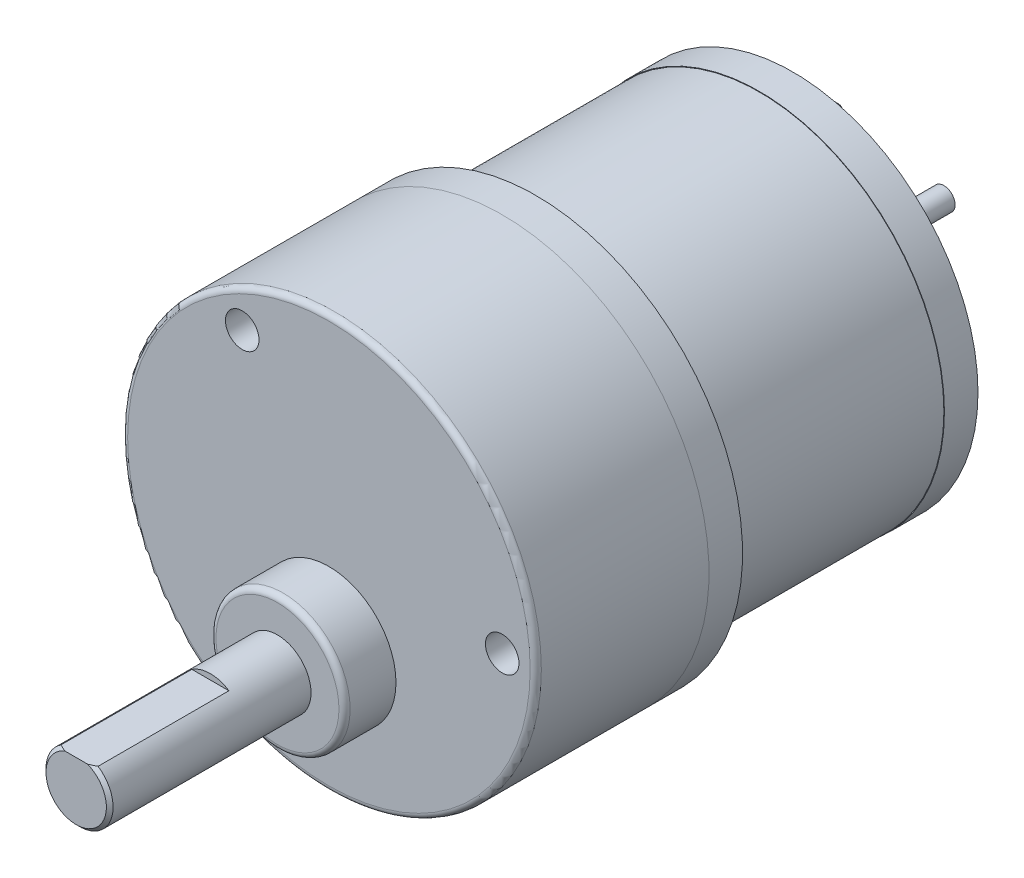
ISO-10303-21;
HEADER;
FILE_DESCRIPTION(('STEP AP214'),'2;1');
FILE_NAME('part.step','',(''),(''),'','','');
FILE_SCHEMA(('AUTOMOTIVE_DESIGN { 1 0 10303 214 1 1 1 1 }'));
ENDSEC;
DATA;
#1=APPLICATION_CONTEXT('core data for automotive mechanical design processes');
#2=APPLICATION_PROTOCOL_DEFINITION('international standard','automotive_design',2000,#1);
#3=PRODUCT_CONTEXT('',#1,'mechanical');
#4=PRODUCT('Part','Part','',(#3));
#5=PRODUCT_RELATED_PRODUCT_CATEGORY('part','',(#4));
#6=PRODUCT_DEFINITION_FORMATION('','',#4);
#7=PRODUCT_DEFINITION_CONTEXT('part definition',#1,'design');
#8=PRODUCT_DEFINITION('design','',#6,#7);
#9=PRODUCT_DEFINITION_SHAPE('','',#8);
#10=(LENGTH_UNIT() NAMED_UNIT(*) SI_UNIT(.MILLI.,.METRE.));
#11=(NAMED_UNIT(*) PLANE_ANGLE_UNIT() SI_UNIT($,.RADIAN.));
#12=(NAMED_UNIT(*) SI_UNIT($,.STERADIAN.) SOLID_ANGLE_UNIT());
#13=UNCERTAINTY_MEASURE_WITH_UNIT(LENGTH_MEASURE(1.E-05),#10,'distance_accuracy_value','');
#14=(GEOMETRIC_REPRESENTATION_CONTEXT(3) GLOBAL_UNCERTAINTY_ASSIGNED_CONTEXT((#13)) GLOBAL_UNIT_ASSIGNED_CONTEXT((#10,
#11,#12)) REPRESENTATION_CONTEXT('',''));
#15=CARTESIAN_POINT('',(0.,0.,0.));
#16=DIRECTION('',(0.,0.,1.));
#17=DIRECTION('',(1.,0.,0.));
#18=AXIS2_PLACEMENT_3D('',#15,#16,#17);
#19=CARTESIAN_POINT('',(0.,0.,-26.));
#20=DIRECTION('',(0.,0.,-1.));
#21=DIRECTION('',(-1.,0.,0.));
#22=AXIS2_PLACEMENT_3D('',#19,#20,#21);
#23=PLANE('',#22);
#24=DIRECTION('',(-1.,0.,0.));
#25=VECTOR('',#24,1.);
#26=CARTESIAN_POINT('',(0.5,10.,-26.));
#27=LINE('',#26,#25);
#28=CARTESIAN_POINT('',(0.5,10.,-26.));
#29=VERTEX_POINT('',#28);
#30=CARTESIAN_POINT('',(-0.5,10.,-26.));
#31=VERTEX_POINT('',#30);
#32=EDGE_CURVE('E194',#29,#31,#27,.T.);
#33=ORIENTED_EDGE('',*,*,#32,.F.);
#34=DIRECTION('',(0.,-1.,0.));
#35=VECTOR('',#34,1.);
#36=CARTESIAN_POINT('',(0.5,13.,-26.));
#37=LINE('',#36,#35);
#38=CARTESIAN_POINT('',(0.5,13.,-26.));
#39=VERTEX_POINT('',#38);
#40=EDGE_CURVE('E191',#39,#29,#37,.T.);
#41=ORIENTED_EDGE('',*,*,#40,.F.);
#42=DIRECTION('',(1.,0.,0.));
#43=VECTOR('',#42,1.);
#44=CARTESIAN_POINT('',(0.5,13.,-26.));
#45=LINE('',#44,#43);
#46=CARTESIAN_POINT('',(-0.5,13.,-26.));
#47=VERTEX_POINT('',#46);
#48=EDGE_CURVE('E200',#47,#39,#45,.T.);
#49=ORIENTED_EDGE('',*,*,#48,.F.);
#50=DIRECTION('',(0.,1.,0.));
#51=VECTOR('',#50,1.);
#52=CARTESIAN_POINT('',(-0.5,13.,-26.));
#53=LINE('',#52,#51);
#54=EDGE_CURVE('E197',#31,#47,#53,.T.);
#55=ORIENTED_EDGE('',*,*,#54,.F.);
#56=EDGE_LOOP('',(#33,#41,#49,#55));
#57=FACE_BOUND('',#56,.T.);
#58=CARTESIAN_POINT('',(0.,0.,-26.));
#59=DIRECTION('',(0.,0.,-1.));
#60=DIRECTION('',(-1.,0.,0.));
#61=AXIS2_PLACEMENT_3D('',#58,#59,#60);
#62=CIRCLE('',#61,16.55);
#63=CARTESIAN_POINT('',(-16.55,0.,-26.));
#64=VERTEX_POINT('',#63);
#65=EDGE_CURVE('E224',#64,#64,#62,.T.);
#66=ORIENTED_EDGE('',*,*,#65,.T.);
#67=EDGE_LOOP('',(#66));
#68=FACE_BOUND('',#67,.T.);
#69=CARTESIAN_POINT('',(0.,0.,-26.));
#70=DIRECTION('',(0.,0.,-1.));
#71=DIRECTION('',(-1.,0.,0.));
#72=AXIS2_PLACEMENT_3D('',#69,#70,#71);
#73=CIRCLE('',#72,4.5);
#74=CARTESIAN_POINT('',(-4.5,0.,-26.));
#75=VERTEX_POINT('',#74);
#76=EDGE_CURVE('E215',#75,#75,#73,.T.);
#77=ORIENTED_EDGE('',*,*,#76,.F.);
#78=EDGE_LOOP('',(#77));
#79=FACE_BOUND('',#78,.T.);
#80=DIRECTION('',(-1.,0.,0.));
#81=VECTOR('',#80,1.);
#82=CARTESIAN_POINT('',(0.5,-13.,-26.));
#83=LINE('',#82,#81);
#84=CARTESIAN_POINT('',(0.5,-13.,-26.));
#85=VERTEX_POINT('',#84);
#86=CARTESIAN_POINT('',(-0.499999999999999,-13.,-26.));
#87=VERTEX_POINT('',#86);
#88=EDGE_CURVE('E174',#85,#87,#83,.T.);
#89=ORIENTED_EDGE('',*,*,#88,.F.);
#90=DIRECTION('',(0.,-1.,0.));
#91=VECTOR('',#90,1.);
#92=CARTESIAN_POINT('',(0.500000000000001,-10.,-26.));
#93=LINE('',#92,#91);
#94=CARTESIAN_POINT('',(0.500000000000001,-10.,-26.));
#95=VERTEX_POINT('',#94);
#96=EDGE_CURVE('E171',#95,#85,#93,.T.);
#97=ORIENTED_EDGE('',*,*,#96,.F.);
#98=DIRECTION('',(1.,0.,0.));
#99=VECTOR('',#98,1.);
#100=CARTESIAN_POINT('',(0.500000000000001,-10.,-26.));
#101=LINE('',#100,#99);
#102=CARTESIAN_POINT('',(-0.499999999999999,-10.,-26.));
#103=VERTEX_POINT('',#102);
#104=EDGE_CURVE('E180',#103,#95,#101,.T.);
#105=ORIENTED_EDGE('',*,*,#104,.F.);
#106=DIRECTION('',(0.,1.,0.));
#107=VECTOR('',#106,1.);
#108=CARTESIAN_POINT('',(-0.499999999999999,-10.,-26.));
#109=LINE('',#108,#107);
#110=EDGE_CURVE('E177',#87,#103,#109,.T.);
#111=ORIENTED_EDGE('',*,*,#110,.F.);
#112=EDGE_LOOP('',(#89,#97,#105,#111));
#113=FACE_BOUND('',#112,.T.);
#114=ADVANCED_FACE('F32',(#57,#68,#79,#113),#23,.T.);
#115=CARTESIAN_POINT('',(0.,0.,-29.));
#116=DIRECTION('',(0.,0.,-1.));
#117=DIRECTION('',(-1.,0.,0.));
#118=AXIS2_PLACEMENT_3D('',#115,#116,#117);
#119=PLANE('',#118);
#120=CARTESIAN_POINT('',(0.,0.,-29.));
#121=DIRECTION('',(0.,0.,-1.));
#122=DIRECTION('',(-1.,0.,0.));
#123=AXIS2_PLACEMENT_3D('',#120,#121,#122);
#124=CIRCLE('',#123,4.5);
#125=CARTESIAN_POINT('',(-4.5,0.,-29.));
#126=VERTEX_POINT('',#125);
#127=EDGE_CURVE('E218',#126,#126,#124,.T.);
#128=ORIENTED_EDGE('',*,*,#127,.T.);
#129=EDGE_LOOP('',(#128));
#130=FACE_BOUND('',#129,.T.);
#131=CARTESIAN_POINT('',(0.,0.,-29.));
#132=DIRECTION('',(0.,0.,-1.));
#133=DIRECTION('',(-1.,0.,0.));
#134=AXIS2_PLACEMENT_3D('',#131,#132,#133);
#135=CIRCLE('',#134,1.);
#136=CARTESIAN_POINT('',(1.,0.,-29.));
#137=VERTEX_POINT('',#136);
#138=EDGE_CURVE('E211',#137,#137,#135,.T.);
#139=ORIENTED_EDGE('',*,*,#138,.F.);
#140=EDGE_LOOP('',(#139));
#141=FACE_BOUND('',#140,.T.);
#142=ADVANCED_FACE('F438',(#130,#141),#119,.T.);
#143=CARTESIAN_POINT('',(0.,0.,-3.));
#144=DIRECTION('',(0.,0.,-1.));
#145=DIRECTION('',(-1.,0.,0.));
#146=AXIS2_PLACEMENT_3D('',#143,#144,#145);
#147=PLANE('',#146);
#148=CARTESIAN_POINT('',(0.,0.,-3.));
#149=DIRECTION('',(0.,0.,-1.));
#150=DIRECTION('',(-1.,0.,0.));
#151=AXIS2_PLACEMENT_3D('',#148,#149,#150);
#152=CIRCLE('',#151,18.495);
#153=CARTESIAN_POINT('',(-18.495,0.,-3.));
#154=VERTEX_POINT('',#153);
#155=EDGE_CURVE('E236',#154,#154,#152,.T.);
#156=ORIENTED_EDGE('',*,*,#155,.T.);
#157=EDGE_LOOP('',(#156));
#158=FACE_BOUND('',#157,.T.);
#159=CARTESIAN_POINT('',(0.,0.,-3.));
#160=DIRECTION('',(0.,0.,-1.));
#161=DIRECTION('',(-1.,0.,0.));
#162=AXIS2_PLACEMENT_3D('',#159,#160,#161);
#163=CIRCLE('',#162,16.5);
#164=CARTESIAN_POINT('',(-16.5,0.,-3.));
#165=VERTEX_POINT('',#164);
#166=EDGE_CURVE('E227',#165,#165,#163,.T.);
#167=ORIENTED_EDGE('',*,*,#166,.F.);
#168=EDGE_LOOP('',(#167));
#169=FACE_BOUND('',#168,.T.);
#170=ADVANCED_FACE('F262',(#158,#169),#147,.T.);
#171=CARTESIAN_POINT('',(0.,-7.,20.1));
#172=DIRECTION('',(0.,0.,1.));
#173=DIRECTION('',(1.,0.,0.));
#174=AXIS2_PLACEMENT_3D('',#171,#172,#173);
#175=PLANE('',#174);
#176=CARTESIAN_POINT('',(0.,-7.,20.1));
#177=DIRECTION('',(0.,0.,1.));
#178=DIRECTION('',(1.,0.,0.));
#179=AXIS2_PLACEMENT_3D('',#176,#177,#178);
#180=CIRCLE('',#179,5.5);
#181=CARTESIAN_POINT('',(5.5,-7.,20.1));
#182=VERTEX_POINT('',#181);
#183=EDGE_CURVE('E329',#182,#182,#180,.T.);
#184=ORIENTED_EDGE('',*,*,#183,.T.);
#185=EDGE_LOOP('',(#184));
#186=FACE_BOUND('',#185,.T.);
#187=CARTESIAN_POINT('',(0.,-7.,20.1));
#188=DIRECTION('',(0.,0.,1.));
#189=DIRECTION('',(1.,0.,0.));
#190=AXIS2_PLACEMENT_3D('',#187,#188,#189);
#191=CIRCLE('',#190,3.);
#192=CARTESIAN_POINT('',(3.,-7.,20.1));
#193=VERTEX_POINT('',#192);
#194=EDGE_CURVE('E239',#193,#193,#191,.T.);
#195=ORIENTED_EDGE('',*,*,#194,.F.);
#196=EDGE_LOOP('',(#195));
#197=FACE_BOUND('',#196,.T.);
#198=ADVANCED_FACE('F270',(#186,#197),#175,.T.);
#199=CARTESIAN_POINT('',(0.,0.,15.5));
#200=DIRECTION('',(0.,0.,1.));
#201=DIRECTION('',(1.,0.,0.));
#202=AXIS2_PLACEMENT_3D('',#199,#200,#201);
#203=PLANE('',#202);
#204=CARTESIAN_POINT('',(0.,0.,15.5));
#205=DIRECTION('',(0.,0.,1.));
#206=DIRECTION('',(1.,0.,0.));
#207=AXIS2_PLACEMENT_3D('',#204,#205,#206);
#208=CIRCLE('',#207,18.);
#209=CARTESIAN_POINT('',(18.,0.,15.5));
#210=VERTEX_POINT('',#209);
#211=EDGE_CURVE('E339',#210,#210,#208,.T.);
#212=ORIENTED_EDGE('',*,*,#211,.T.);
#213=EDGE_LOOP('',(#212));
#214=FACE_BOUND('',#213,.T.);
#215=CARTESIAN_POINT('',(-7.74999999999994,13.4233937586588,15.5));
#216=DIRECTION('',(0.,0.,1.));
#217=DIRECTION('',(1.,0.,0.));
#218=AXIS2_PLACEMENT_3D('',#215,#216,#217);
#219=CIRCLE('',#218,1.5);
#220=CARTESIAN_POINT('',(-6.24999999999994,13.4233937586588,15.5));
#221=VERTEX_POINT('',#220);
#222=EDGE_CURVE('E140',#221,#221,#219,.T.);
#223=ORIENTED_EDGE('',*,*,#222,.F.);
#224=EDGE_LOOP('',(#223));
#225=FACE_BOUND('',#224,.T.);
#226=CARTESIAN_POINT('',(-7.75,-13.4233937586588,15.5));
#227=DIRECTION('',(0.,0.,1.));
#228=DIRECTION('',(1.,0.,0.));
#229=AXIS2_PLACEMENT_3D('',#226,#227,#228);
#230=CIRCLE('',#229,1.5);
#231=CARTESIAN_POINT('',(-6.25,-13.4233937586588,15.5));
#232=VERTEX_POINT('',#231);
#233=EDGE_CURVE('E147',#232,#232,#230,.T.);
#234=ORIENTED_EDGE('',*,*,#233,.F.);
#235=EDGE_LOOP('',(#234));
#236=FACE_BOUND('',#235,.T.);
#237=CARTESIAN_POINT('',(15.5,0.,15.5));
#238=DIRECTION('',(0.,0.,1.));
#239=DIRECTION('',(1.,0.,0.));
#240=AXIS2_PLACEMENT_3D('',#237,#238,#239);
#241=CIRCLE('',#240,1.5);
#242=CARTESIAN_POINT('',(17.,0.,15.5));
#243=VERTEX_POINT('',#242);
#244=EDGE_CURVE('E153',#243,#243,#241,.T.);
#245=ORIENTED_EDGE('',*,*,#244,.F.);
#246=EDGE_LOOP('',(#245));
#247=FACE_BOUND('',#246,.T.);
#248=CARTESIAN_POINT('',(0.,-7.,15.5));
#249=DIRECTION('',(0.,0.,1.));
#250=DIRECTION('',(1.,0.,0.));
#251=AXIS2_PLACEMENT_3D('',#248,#249,#250);
#252=CIRCLE('',#251,6.);
#253=CARTESIAN_POINT('',(6.,-7.,15.5));
#254=VERTEX_POINT('',#253);
#255=EDGE_CURVE('E305',#254,#254,#252,.T.);
#256=ORIENTED_EDGE('',*,*,#255,.F.);
#257=EDGE_LOOP('',(#256));
#258=FACE_BOUND('',#257,.T.);
#259=ADVANCED_FACE('F273',(#214,#225,#236,#247,#258),#203,.T.);
#260=CARTESIAN_POINT('',(0.,0.,15.5));
#261=DIRECTION('',(0.,0.,-1.));
#262=DIRECTION('',(-1.,0.,0.));
#263=AXIS2_PLACEMENT_3D('',#260,#261,#262);
#264=CYLINDRICAL_SURFACE('',#263,18.5);
#265=CARTESIAN_POINT('',(0.,0.,15.));
#266=DIRECTION('',(0.,0.,1.));
#267=DIRECTION('',(1.,0.,0.));
#268=AXIS2_PLACEMENT_3D('',#265,#266,#267);
#269=CIRCLE('',#268,18.5);
#270=CARTESIAN_POINT('',(18.5,0.,15.));
#271=VERTEX_POINT('',#270);
#272=EDGE_CURVE('E342',#271,#271,#269,.F.);
#273=ORIENTED_EDGE('',*,*,#272,.T.);
#274=EDGE_LOOP('',(#273));
#275=FACE_BOUND('',#274,.T.);
#276=CARTESIAN_POINT('',(0.,0.,0.));
#277=DIRECTION('',(0.,0.,-1.));
#278=DIRECTION('',(-1.,0.,0.));
#279=AXIS2_PLACEMENT_3D('',#276,#277,#278);
#280=CIRCLE('',#279,18.495);
#281=CARTESIAN_POINT('',(-18.495,0.,0.));
#282=VERTEX_POINT('',#281);
#283=EDGE_CURVE('E233',#282,#282,#280,.T.);
#284=ORIENTED_EDGE('',*,*,#283,.F.);
#285=EDGE_LOOP('',(#284));
#286=FACE_BOUND('',#285,.T.);
#287=ADVANCED_FACE('F277',(#275,#286),#264,.T.);
#288=CARTESIAN_POINT('',(0.,-7.,20.1));
#289=DIRECTION('',(0.,0.,-1.));
#290=DIRECTION('',(-1.,0.,0.));
#291=AXIS2_PLACEMENT_3D('',#288,#289,#290);
#292=CYLINDRICAL_SURFACE('',#291,6.);
#293=CARTESIAN_POINT('',(0.,-7.,19.6));
#294=DIRECTION('',(0.,0.,1.));
#295=DIRECTION('',(1.,0.,0.));
#296=AXIS2_PLACEMENT_3D('',#293,#294,#295);
#297=CIRCLE('',#296,6.);
#298=CARTESIAN_POINT('',(6.,-7.,19.6));
#299=VERTEX_POINT('',#298);
#300=EDGE_CURVE('E336',#299,#299,#297,.F.);
#301=ORIENTED_EDGE('',*,*,#300,.T.);
#302=EDGE_LOOP('',(#301));
#303=FACE_BOUND('',#302,.T.);
#304=ORIENTED_EDGE('',*,*,#255,.T.);
#305=EDGE_LOOP('',(#304));
#306=FACE_BOUND('',#305,.T.);
#307=ADVANCED_FACE('F269',(#303,#306),#292,.T.);
#308=CARTESIAN_POINT('',(0.,-7.,38.1));
#309=DIRECTION('',(0.,0.,-1.));
#310=DIRECTION('',(-1.,0.,0.));
#311=AXIS2_PLACEMENT_3D('',#308,#309,#310);
#312=CYLINDRICAL_SURFACE('',#311,3.);
#313=DIRECTION('',(0.,0.,1.));
#314=VECTOR('',#313,1.);
#315=CARTESIAN_POINT('',(1.6583123951777,-4.5,26.1));
#316=LINE('',#315,#314);
#317=CARTESIAN_POINT('',(1.6583123951777,-4.5,26.1));
#318=VERTEX_POINT('',#317);
#319=CARTESIAN_POINT('',(1.6583123951777,-4.5,37.8));
#320=VERTEX_POINT('',#319);
#321=EDGE_CURVE('E135',#318,#320,#316,.T.);
#322=ORIENTED_EDGE('',*,*,#321,.T.);
#323=CARTESIAN_POINT('',(0.,-7.,37.8));
#324=DIRECTION('',(0.,0.,1.));
#325=DIRECTION('',(1.,0.,0.));
#326=AXIS2_PLACEMENT_3D('',#323,#324,#325);
#327=CIRCLE('',#326,3.);
#328=CARTESIAN_POINT('',(-1.6583123951777,-4.5,37.8));
#329=VERTEX_POINT('',#328);
#330=EDGE_CURVE('E11',#320,#329,#327,.F.);
#331=ORIENTED_EDGE('',*,*,#330,.T.);
#332=DIRECTION('',(0.,0.,1.));
#333=VECTOR('',#332,1.);
#334=CARTESIAN_POINT('',(-1.6583123951777,-4.5,26.1));
#335=LINE('',#334,#333);
#336=CARTESIAN_POINT('',(-1.6583123951777,-4.5,26.1));
#337=VERTEX_POINT('',#336);
#338=EDGE_CURVE('E133',#337,#329,#335,.T.);
#339=ORIENTED_EDGE('',*,*,#338,.F.);
#340=CARTESIAN_POINT('',(0.,-7.00000000000001,26.1));
#341=DIRECTION('',(0.,0.,1.));
#342=DIRECTION('',(-1.,0.,0.));
#343=AXIS2_PLACEMENT_3D('',#340,#341,#342);
#344=CIRCLE('',#343,3.00000000000001);
#345=EDGE_CURVE('E126',#318,#337,#344,.T.);
#346=ORIENTED_EDGE('',*,*,#345,.F.);
#347=EDGE_LOOP('',(#322,#331,#339,#346));
#348=FACE_BOUND('',#347,.T.);
#349=ORIENTED_EDGE('',*,*,#194,.T.);
#350=EDGE_LOOP('',(#349));
#351=FACE_BOUND('',#350,.T.);
#352=ADVANCED_FACE('F137',(#348,#351),#312,.T.);
#353=CARTESIAN_POINT('',(0.,-7.,38.1));
#354=DIRECTION('',(0.,0.,1.));
#355=DIRECTION('',(1.,0.,0.));
#356=AXIS2_PLACEMENT_3D('',#353,#354,#355);
#357=PLANE('',#356);
#358=DIRECTION('',(1.,0.,0.));
#359=VECTOR('',#358,1.);
#360=CARTESIAN_POINT('',(-1.6583123951777,-4.5,38.1));
#361=LINE('',#360,#359);
#362=CARTESIAN_POINT('',(-1.01980390271854,-4.5,38.1));
#363=VERTEX_POINT('',#362);
#364=CARTESIAN_POINT('',(1.01980390271854,-4.5,38.1));
#365=VERTEX_POINT('',#364);
#366=EDGE_CURVE('E130',#363,#365,#361,.T.);
#367=ORIENTED_EDGE('',*,*,#366,.F.);
#368=CARTESIAN_POINT('',(0.,-7.,38.1));
#369=DIRECTION('',(0.,0.,1.));
#370=DIRECTION('',(1.,0.,0.));
#371=AXIS2_PLACEMENT_3D('',#368,#369,#370);
#372=CIRCLE('',#371,2.69999999999999);
#373=EDGE_CURVE('E345',#363,#365,#372,.T.);
#374=ORIENTED_EDGE('',*,*,#373,.T.);
#375=EDGE_LOOP('',(#367,#374));
#376=FACE_BOUND('',#375,.T.);
#377=ADVANCED_FACE('F260',(#376),#357,.T.);
#378=CARTESIAN_POINT('',(0.,0.,-3.));
#379=DIRECTION('',(0.,0.,1.));
#380=DIRECTION('',(1.,0.,0.));
#381=AXIS2_PLACEMENT_3D('',#378,#379,#380);
#382=CYLINDRICAL_SURFACE('',#381,18.495);
#383=ORIENTED_EDGE('',*,*,#155,.F.);
#384=EDGE_LOOP('',(#383));
#385=FACE_BOUND('',#384,.T.);
#386=ORIENTED_EDGE('',*,*,#283,.T.);
#387=EDGE_LOOP('',(#386));
#388=FACE_BOUND('',#387,.T.);
#389=ADVANCED_FACE('F249',(#385,#388),#382,.T.);
#390=CARTESIAN_POINT('',(0.,0.,-23.));
#391=DIRECTION('',(0.,0.,1.));
#392=DIRECTION('',(1.,0.,0.));
#393=AXIS2_PLACEMENT_3D('',#390,#391,#392);
#394=CYLINDRICAL_SURFACE('',#393,16.5);
#395=CARTESIAN_POINT('',(0.,0.,-23.));
#396=DIRECTION('',(0.,0.,-1.));
#397=DIRECTION('',(-1.,0.,0.));
#398=AXIS2_PLACEMENT_3D('',#395,#396,#397);
#399=CIRCLE('',#398,16.5);
#400=CARTESIAN_POINT('',(-16.5,0.,-23.));
#401=VERTEX_POINT('',#400);
#402=EDGE_CURVE('E230',#401,#401,#399,.T.);
#403=ORIENTED_EDGE('',*,*,#402,.F.);
#404=EDGE_LOOP('',(#403));
#405=FACE_BOUND('',#404,.T.);
#406=ORIENTED_EDGE('',*,*,#166,.T.);
#407=EDGE_LOOP('',(#406));
#408=FACE_BOUND('',#407,.T.);
#409=ADVANCED_FACE('F259',(#405,#408),#394,.T.);
#410=CARTESIAN_POINT('',(0.,0.,-23.));
#411=DIRECTION('',(0.,0.,-1.));
#412=DIRECTION('',(-1.,0.,0.));
#413=AXIS2_PLACEMENT_3D('',#410,#411,#412);
#414=PLANE('',#413);
#415=CARTESIAN_POINT('',(0.,0.,-23.));
#416=DIRECTION('',(0.,0.,-1.));
#417=DIRECTION('',(-1.,0.,0.));
#418=AXIS2_PLACEMENT_3D('',#415,#416,#417);
#419=CIRCLE('',#418,16.55);
#420=CARTESIAN_POINT('',(-16.55,0.,-23.));
#421=VERTEX_POINT('',#420);
#422=EDGE_CURVE('E221',#421,#421,#419,.T.);
#423=ORIENTED_EDGE('',*,*,#422,.F.);
#424=EDGE_LOOP('',(#423));
#425=FACE_BOUND('',#424,.T.);
#426=ORIENTED_EDGE('',*,*,#402,.T.);
#427=EDGE_LOOP('',(#426));
#428=FACE_BOUND('',#427,.T.);
#429=ADVANCED_FACE('F449',(#425,#428),#414,.F.);
#430=CARTESIAN_POINT('',(0.,0.,-26.));
#431=DIRECTION('',(0.,0.,1.));
#432=DIRECTION('',(1.,0.,0.));
#433=AXIS2_PLACEMENT_3D('',#430,#431,#432);
#434=CYLINDRICAL_SURFACE('',#433,16.55);
#435=ORIENTED_EDGE('',*,*,#65,.F.);
#436=EDGE_LOOP('',(#435));
#437=FACE_BOUND('',#436,.T.);
#438=ORIENTED_EDGE('',*,*,#422,.T.);
#439=EDGE_LOOP('',(#438));
#440=FACE_BOUND('',#439,.T.);
#441=ADVANCED_FACE('F444',(#437,#440),#434,.T.);
#442=CARTESIAN_POINT('',(0.,0.,-29.));
#443=DIRECTION('',(0.,0.,1.));
#444=DIRECTION('',(1.,0.,0.));
#445=AXIS2_PLACEMENT_3D('',#442,#443,#444);
#446=CYLINDRICAL_SURFACE('',#445,4.5);
#447=ORIENTED_EDGE('',*,*,#127,.F.);
#448=EDGE_LOOP('',(#447));
#449=FACE_BOUND('',#448,.T.);
#450=ORIENTED_EDGE('',*,*,#76,.T.);
#451=EDGE_LOOP('',(#450));
#452=FACE_BOUND('',#451,.T.);
#453=ADVANCED_FACE('F436',(#449,#452),#446,.T.);
#454=CARTESIAN_POINT('',(0.,0.,-39.5));
#455=DIRECTION('',(0.,0.,1.));
#456=DIRECTION('',(1.,0.,0.));
#457=AXIS2_PLACEMENT_3D('',#454,#455,#456);
#458=CYLINDRICAL_SURFACE('',#457,1.);
#459=CARTESIAN_POINT('',(0.,0.,-39.5));
#460=DIRECTION('',(0.,0.,-1.));
#461=DIRECTION('',(-1.,0.,0.));
#462=AXIS2_PLACEMENT_3D('',#459,#460,#461);
#463=CIRCLE('',#462,1.);
#464=CARTESIAN_POINT('',(1.,0.,-39.5));
#465=VERTEX_POINT('',#464);
#466=EDGE_CURVE('E212',#465,#465,#463,.T.);
#467=CARTESIAN_POINT('',(1.,0.,-39.5));
#468=CARTESIAN_POINT('',(1.,0.,-39.390625));
#469=CARTESIAN_POINT('',(1.,0.,-39.28125));
#470=CARTESIAN_POINT('',(1.,0.,-39.0625));
#471=CARTESIAN_POINT('',(1.,0.,-38.953125));
#472=CARTESIAN_POINT('',(1.,0.,-38.734375));
#473=CARTESIAN_POINT('',(1.,0.,-38.625));
#474=CARTESIAN_POINT('',(1.,0.,-38.40625));
#475=CARTESIAN_POINT('',(1.,0.,-38.296875));
#476=CARTESIAN_POINT('',(1.,0.,-38.078125));
#477=CARTESIAN_POINT('',(1.,0.,-37.96875));
#478=CARTESIAN_POINT('',(1.,0.,-37.75));
#479=CARTESIAN_POINT('',(1.,0.,-37.640625));
#480=CARTESIAN_POINT('',(1.,0.,-37.421875));
#481=CARTESIAN_POINT('',(1.,0.,-37.3125));
#482=CARTESIAN_POINT('',(1.,0.,-37.09375));
#483=CARTESIAN_POINT('',(1.,0.,-36.984375));
#484=CARTESIAN_POINT('',(1.,0.,-36.765625));
#485=CARTESIAN_POINT('',(1.,0.,-36.65625));
#486=CARTESIAN_POINT('',(1.,0.,-36.4375));
#487=CARTESIAN_POINT('',(1.,0.,-36.328125));
#488=CARTESIAN_POINT('',(1.,0.,-36.109375));
#489=CARTESIAN_POINT('',(1.,0.,-36.));
#490=CARTESIAN_POINT('',(1.,0.,-35.78125));
#491=CARTESIAN_POINT('',(1.,0.,-35.671875));
#492=CARTESIAN_POINT('',(1.,0.,-35.453125));
#493=CARTESIAN_POINT('',(1.,0.,-35.34375));
#494=CARTESIAN_POINT('',(1.,0.,-35.125));
#495=CARTESIAN_POINT('',(1.,0.,-35.015625));
#496=CARTESIAN_POINT('',(1.,0.,-34.796875));
#497=CARTESIAN_POINT('',(1.,0.,-34.6875));
#498=CARTESIAN_POINT('',(1.,0.,-34.46875));
#499=CARTESIAN_POINT('',(1.,0.,-34.359375));
#500=CARTESIAN_POINT('',(1.,0.,-34.140625));
#501=CARTESIAN_POINT('',(1.,0.,-34.03125));
#502=CARTESIAN_POINT('',(1.,0.,-33.8125));
#503=CARTESIAN_POINT('',(1.,0.,-33.703125));
#504=CARTESIAN_POINT('',(1.,0.,-33.484375));
#505=CARTESIAN_POINT('',(1.,0.,-33.375));
#506=CARTESIAN_POINT('',(1.,0.,-33.15625));
#507=CARTESIAN_POINT('',(1.,0.,-33.046875));
#508=CARTESIAN_POINT('',(1.,0.,-32.828125));
#509=CARTESIAN_POINT('',(1.,0.,-32.71875));
#510=CARTESIAN_POINT('',(1.,0.,-32.5));
#511=CARTESIAN_POINT('',(1.,0.,-32.390625));
#512=CARTESIAN_POINT('',(1.,0.,-32.171875));
#513=CARTESIAN_POINT('',(1.,0.,-32.0625));
#514=CARTESIAN_POINT('',(1.,0.,-31.84375));
#515=CARTESIAN_POINT('',(1.,0.,-31.734375));
#516=CARTESIAN_POINT('',(1.,0.,-31.515625));
#517=CARTESIAN_POINT('',(1.,0.,-31.40625));
#518=CARTESIAN_POINT('',(1.,0.,-31.1875));
#519=CARTESIAN_POINT('',(1.,0.,-31.078125));
#520=CARTESIAN_POINT('',(1.,0.,-30.859375));
#521=CARTESIAN_POINT('',(1.,0.,-30.75));
#522=CARTESIAN_POINT('',(1.,0.,-30.53125));
#523=CARTESIAN_POINT('',(1.,0.,-30.421875));
#524=CARTESIAN_POINT('',(1.,0.,-30.203125));
#525=CARTESIAN_POINT('',(1.,0.,-30.09375));
#526=CARTESIAN_POINT('',(1.,0.,-29.875));
#527=CARTESIAN_POINT('',(1.,0.,-29.765625));
#528=CARTESIAN_POINT('',(1.,0.,-29.546875));
#529=CARTESIAN_POINT('',(1.,0.,-29.4375));
#530=CARTESIAN_POINT('',(1.,0.,-29.21875));
#531=CARTESIAN_POINT('',(1.,0.,-29.109375));
#532=CARTESIAN_POINT('',(1.,0.,-29.));
#533=B_SPLINE_CURVE_WITH_KNOTS('',3,(#467,#468,#469,#470,#471,#472,#473,#474,#475,#476,#477,
#478,#479,#480,#481,#482,#483,#484,#485,#486,#487,#488,#489,#490,#491,#492,#493,#494,#495,#496,
#497,#498,#499,#500,#501,#502,#503,#504,#505,#506,#507,#508,#509,#510,#511,#512,#513,#514,#515,
#516,#517,#518,#519,#520,#521,#522,#523,#524,#525,#526,#527,#528,#529,#530,#531,#532),
.UNSPECIFIED.,.F.,.F.,(4,2,2,2,2,2,2,2,2,2,2,2,2,2,2,2,2,2,2,2,2,2,2,2,2,2,2,2,2,2,2,2,4),(0.,
0.328124999999999,0.656249999999997,0.984374999999996,1.31249999999999,1.640625,1.96875,
2.296875,2.625,2.95312499999999,3.28125,3.609375,3.9375,4.26562499999999,4.59374999999999,
4.921875,5.25,5.578125,5.90624999999999,6.234375,6.5625,6.890625,7.21875,7.54687499999999,
7.87499999999999,8.203125,8.53125,8.859375,9.18749999999999,9.515625,9.84375,10.171875,10.5),.UNSPECIFIED.);
#534=EDGE_CURVE('BSEAM432',#465,#137,#533,.T.);
#535=ORIENTED_EDGE('',*,*,#466,.F.);
#536=ORIENTED_EDGE('',*,*,#138,.T.);
#537=ORIENTED_EDGE('',*,*,#534,.T.);
#538=ORIENTED_EDGE('',*,*,#534,.F.);
#539=EDGE_LOOP('',(#535,#537,#536,#538));
#540=FACE_BOUND('',#539,.T.);
#541=ADVANCED_FACE('F432',(#540),#458,.T.);
#542=CARTESIAN_POINT('',(0.,0.,-39.5));
#543=DIRECTION('',(0.,0.,-1.));
#544=DIRECTION('',(-1.,0.,0.));
#545=AXIS2_PLACEMENT_3D('',#542,#543,#544);
#546=PLANE('',#545);
#547=ORIENTED_EDGE('',*,*,#466,.T.);
#548=EDGE_LOOP('',(#547));
#549=FACE_BOUND('',#548,.T.);
#550=ADVANCED_FACE('F428',(#549),#546,.T.);
#551=CARTESIAN_POINT('',(0.5,13.,-30.));
#552=DIRECTION('',(-1.,0.,0.));
#553=DIRECTION('',(0.,-1.,0.));
#554=AXIS2_PLACEMENT_3D('',#551,#552,#553);
#555=PLANE('',#554);
#556=CARTESIAN_POINT('',(0.5,11.5,-28.5));
#557=DIRECTION('',(1.,0.,0.));
#558=DIRECTION('',(0.,1.,0.));
#559=AXIS2_PLACEMENT_3D('',#556,#557,#558);
#560=CIRCLE('',#559,0.750000000000002);
#561=CARTESIAN_POINT('',(0.5,12.25,-28.5));
#562=VERTEX_POINT('',#561);
#563=EDGE_CURVE('E167',#562,#562,#560,.T.);
#564=ORIENTED_EDGE('',*,*,#563,.F.);
#565=EDGE_LOOP('',(#564));
#566=FACE_BOUND('',#565,.T.);
#567=DIRECTION('',(0.,0.,1.));
#568=VECTOR('',#567,1.);
#569=CARTESIAN_POINT('',(0.5,10.,-30.));
#570=LINE('',#569,#568);
#571=CARTESIAN_POINT('',(0.5,10.,-28.5));
#572=VERTEX_POINT('',#571);
#573=EDGE_CURVE('E209',#572,#29,#570,.T.);
#574=ORIENTED_EDGE('',*,*,#573,.F.);
#575=CARTESIAN_POINT('',(0.5,11.5,-28.5));
#576=DIRECTION('',(-1.,0.,0.));
#577=DIRECTION('',(0.,-1.,0.));
#578=AXIS2_PLACEMENT_3D('',#575,#576,#577);
#579=CIRCLE('',#578,1.5);
#580=CARTESIAN_POINT('',(0.5,11.5,-30.));
#581=VERTEX_POINT('',#580);
#582=EDGE_CURVE('E325',#572,#581,#579,.F.);
#583=ORIENTED_EDGE('',*,*,#582,.T.);
#584=CARTESIAN_POINT('',(0.5,11.5,-28.5));
#585=DIRECTION('',(-1.,0.,0.));
#586=DIRECTION('',(0.,-1.,0.));
#587=AXIS2_PLACEMENT_3D('',#584,#585,#586);
#588=CIRCLE('',#587,1.5);
#589=CARTESIAN_POINT('',(0.5,13.,-28.5));
#590=VERTEX_POINT('',#589);
#591=EDGE_CURVE('E323',#581,#590,#588,.F.);
#592=ORIENTED_EDGE('',*,*,#591,.T.);
#593=DIRECTION('',(0.,0.,1.));
#594=VECTOR('',#593,1.);
#595=CARTESIAN_POINT('',(0.5,13.,-30.));
#596=LINE('',#595,#594);
#597=EDGE_CURVE('E203',#590,#39,#596,.T.);
#598=ORIENTED_EDGE('',*,*,#597,.T.);
#599=ORIENTED_EDGE('',*,*,#40,.T.);
#600=EDGE_LOOP('',(#574,#583,#592,#598,#599));
#601=FACE_BOUND('',#600,.T.);
#602=ADVANCED_FACE('F424',(#566,#601),#555,.F.);
#603=CARTESIAN_POINT('',(0.5,10.,-30.));
#604=DIRECTION('',(0.,1.,0.));
#605=DIRECTION('',(0.,0.,1.));
#606=AXIS2_PLACEMENT_3D('',#603,#604,#605);
#607=PLANE('',#606);
#608=DIRECTION('',(0.,0.,1.));
#609=VECTOR('',#608,1.);
#610=CARTESIAN_POINT('',(-0.5,10.,-30.));
#611=LINE('',#610,#609);
#612=CARTESIAN_POINT('',(-0.5,10.,-28.5));
#613=VERTEX_POINT('',#612);
#614=EDGE_CURVE('E207',#613,#31,#611,.T.);
#615=ORIENTED_EDGE('',*,*,#614,.F.);
#616=DIRECTION('',(-1.,0.,0.));
#617=VECTOR('',#616,1.);
#618=CARTESIAN_POINT('',(0.5,10.,-28.5));
#619=LINE('',#618,#617);
#620=EDGE_CURVE('E320',#613,#572,#619,.F.);
#621=ORIENTED_EDGE('',*,*,#620,.T.);
#622=ORIENTED_EDGE('',*,*,#573,.T.);
#623=ORIENTED_EDGE('',*,*,#32,.T.);
#624=EDGE_LOOP('',(#615,#621,#622,#623));
#625=FACE_BOUND('',#624,.T.);
#626=ADVANCED_FACE('F420',(#625),#607,.F.);
#627=CARTESIAN_POINT('',(-0.5,13.,-30.));
#628=DIRECTION('',(1.,0.,0.));
#629=DIRECTION('',(0.,1.,0.));
#630=AXIS2_PLACEMENT_3D('',#627,#628,#629);
#631=PLANE('',#630);
#632=CARTESIAN_POINT('',(-0.5,11.5,-28.5));
#633=DIRECTION('',(1.,0.,0.));
#634=DIRECTION('',(0.,1.,0.));
#635=AXIS2_PLACEMENT_3D('',#632,#633,#634);
#636=CIRCLE('',#635,0.750000000000002);
#637=CARTESIAN_POINT('',(-0.5,12.25,-28.5));
#638=VERTEX_POINT('',#637);
#639=EDGE_CURVE('E170',#638,#638,#636,.T.);
#640=ORIENTED_EDGE('',*,*,#639,.T.);
#641=EDGE_LOOP('',(#640));
#642=FACE_BOUND('',#641,.T.);
#643=CARTESIAN_POINT('',(-0.5,11.5,-28.5));
#644=DIRECTION('',(1.,0.,0.));
#645=DIRECTION('',(0.,1.,0.));
#646=AXIS2_PLACEMENT_3D('',#643,#644,#645);
#647=CIRCLE('',#646,1.5);
#648=CARTESIAN_POINT('',(-0.5,13.,-28.5));
#649=VERTEX_POINT('',#648);
#650=CARTESIAN_POINT('',(-0.5,11.5,-30.));
#651=VERTEX_POINT('',#650);
#652=EDGE_CURVE('E316',#649,#651,#647,.F.);
#653=ORIENTED_EDGE('',*,*,#652,.T.);
#654=CARTESIAN_POINT('',(-0.5,11.5,-28.5));
#655=DIRECTION('',(1.,0.,0.));
#656=DIRECTION('',(0.,1.,0.));
#657=AXIS2_PLACEMENT_3D('',#654,#655,#656);
#658=CIRCLE('',#657,1.5);
#659=EDGE_CURVE('E318',#651,#613,#658,.F.);
#660=ORIENTED_EDGE('',*,*,#659,.T.);
#661=ORIENTED_EDGE('',*,*,#614,.T.);
#662=ORIENTED_EDGE('',*,*,#54,.T.);
#663=DIRECTION('',(0.,0.,1.));
#664=VECTOR('',#663,1.);
#665=CARTESIAN_POINT('',(-0.5,13.,-30.));
#666=LINE('',#665,#664);
#667=EDGE_CURVE('E205',#649,#47,#666,.T.);
#668=ORIENTED_EDGE('',*,*,#667,.F.);
#669=EDGE_LOOP('',(#653,#660,#661,#662,#668));
#670=FACE_BOUND('',#669,.T.);
#671=ADVANCED_FACE('F416',(#642,#670),#631,.F.);
#672=CARTESIAN_POINT('',(0.5,13.,-30.));
#673=DIRECTION('',(0.,-1.,0.));
#674=DIRECTION('',(0.,0.,-1.));
#675=AXIS2_PLACEMENT_3D('',#672,#673,#674);
#676=PLANE('',#675);
#677=ORIENTED_EDGE('',*,*,#597,.F.);
#678=DIRECTION('',(1.,0.,0.));
#679=VECTOR('',#678,1.);
#680=CARTESIAN_POINT('',(-0.5,13.,-28.5));
#681=LINE('',#680,#679);
#682=EDGE_CURVE('E327',#590,#649,#681,.F.);
#683=ORIENTED_EDGE('',*,*,#682,.T.);
#684=ORIENTED_EDGE('',*,*,#667,.T.);
#685=ORIENTED_EDGE('',*,*,#48,.T.);
#686=EDGE_LOOP('',(#677,#683,#684,#685));
#687=FACE_BOUND('',#686,.T.);
#688=ADVANCED_FACE('F412',(#687),#676,.F.);
#689=CARTESIAN_POINT('',(0.500000000000001,-10.,-30.));
#690=DIRECTION('',(-1.,0.,0.));
#691=DIRECTION('',(0.,-1.,0.));
#692=AXIS2_PLACEMENT_3D('',#689,#690,#691);
#693=PLANE('',#692);
#694=CARTESIAN_POINT('',(0.499999999999997,-11.5,-28.5));
#695=DIRECTION('',(1.,0.,0.));
#696=DIRECTION('',(0.,1.,0.));
#697=AXIS2_PLACEMENT_3D('',#694,#695,#696);
#698=CIRCLE('',#697,0.750000000000002);
#699=CARTESIAN_POINT('',(0.499999999999997,-10.75,-28.5));
#700=VERTEX_POINT('',#699);
#701=EDGE_CURVE('E162',#700,#700,#698,.T.);
#702=ORIENTED_EDGE('',*,*,#701,.F.);
#703=EDGE_LOOP('',(#702));
#704=FACE_BOUND('',#703,.T.);
#705=CARTESIAN_POINT('',(0.500000000000001,-11.5,-28.5));
#706=DIRECTION('',(-1.,0.,0.));
#707=DIRECTION('',(0.,-1.,0.));
#708=AXIS2_PLACEMENT_3D('',#705,#706,#707);
#709=CIRCLE('',#708,1.5);
#710=CARTESIAN_POINT('',(0.5,-13.,-28.5));
#711=VERTEX_POINT('',#710);
#712=CARTESIAN_POINT('',(0.500000000000001,-11.5,-30.));
#713=VERTEX_POINT('',#712);
#714=EDGE_CURVE('E302',#711,#713,#709,.F.);
#715=ORIENTED_EDGE('',*,*,#714,.T.);
#716=CARTESIAN_POINT('',(0.500000000000001,-11.5,-28.5));
#717=DIRECTION('',(-1.,0.,0.));
#718=DIRECTION('',(0.,-1.,0.));
#719=AXIS2_PLACEMENT_3D('',#716,#717,#718);
#720=CIRCLE('',#719,1.5);
#721=CARTESIAN_POINT('',(0.500000000000001,-10.,-28.5));
#722=VERTEX_POINT('',#721);
#723=EDGE_CURVE('E304',#713,#722,#720,.F.);
#724=ORIENTED_EDGE('',*,*,#723,.T.);
#725=DIRECTION('',(0.,0.,1.));
#726=VECTOR('',#725,1.);
#727=CARTESIAN_POINT('',(0.500000000000001,-10.,-30.));
#728=LINE('',#727,#726);
#729=EDGE_CURVE('E183',#722,#95,#728,.T.);
#730=ORIENTED_EDGE('',*,*,#729,.T.);
#731=ORIENTED_EDGE('',*,*,#96,.T.);
#732=DIRECTION('',(0.,0.,1.));
#733=VECTOR('',#732,1.);
#734=CARTESIAN_POINT('',(0.5,-13.,-30.));
#735=LINE('',#734,#733);
#736=EDGE_CURVE('E189',#711,#85,#735,.T.);
#737=ORIENTED_EDGE('',*,*,#736,.F.);
#738=EDGE_LOOP('',(#715,#724,#730,#731,#737));
#739=FACE_BOUND('',#738,.T.);
#740=ADVANCED_FACE('F408',(#704,#739),#693,.F.);
#741=CARTESIAN_POINT('',(0.5,-13.,-30.));
#742=DIRECTION('',(0.,1.,0.));
#743=DIRECTION('',(0.,0.,1.));
#744=AXIS2_PLACEMENT_3D('',#741,#742,#743);
#745=PLANE('',#744);
#746=DIRECTION('',(0.,0.,1.));
#747=VECTOR('',#746,1.);
#748=CARTESIAN_POINT('',(-0.499999999999999,-13.,-30.));
#749=LINE('',#748,#747);
#750=CARTESIAN_POINT('',(-0.499999999999999,-13.,-28.5));
#751=VERTEX_POINT('',#750);
#752=EDGE_CURVE('E187',#751,#87,#749,.T.);
#753=ORIENTED_EDGE('',*,*,#752,.F.);
#754=DIRECTION('',(-1.,0.,0.));
#755=VECTOR('',#754,1.);
#756=CARTESIAN_POINT('',(0.5,-13.,-28.5));
#757=LINE('',#756,#755);
#758=EDGE_CURVE('E314',#751,#711,#757,.F.);
#759=ORIENTED_EDGE('',*,*,#758,.T.);
#760=ORIENTED_EDGE('',*,*,#736,.T.);
#761=ORIENTED_EDGE('',*,*,#88,.T.);
#762=EDGE_LOOP('',(#753,#759,#760,#761));
#763=FACE_BOUND('',#762,.T.);
#764=ADVANCED_FACE('F404',(#763),#745,.F.);
#765=CARTESIAN_POINT('',(-0.499999999999999,-10.,-30.));
#766=DIRECTION('',(1.,0.,0.));
#767=DIRECTION('',(0.,1.,0.));
#768=AXIS2_PLACEMENT_3D('',#765,#766,#767);
#769=PLANE('',#768);
#770=CARTESIAN_POINT('',(-0.5,-11.5,-28.5));
#771=DIRECTION('',(1.,0.,0.));
#772=DIRECTION('',(0.,1.,0.));
#773=AXIS2_PLACEMENT_3D('',#770,#771,#772);
#774=CIRCLE('',#773,0.750000000000002);
#775=CARTESIAN_POINT('',(-0.5,-10.75,-28.5));
#776=VERTEX_POINT('',#775);
#777=EDGE_CURVE('E165',#776,#776,#774,.T.);
#778=ORIENTED_EDGE('',*,*,#777,.T.);
#779=EDGE_LOOP('',(#778));
#780=FACE_BOUND('',#779,.T.);
#781=DIRECTION('',(0.,0.,1.));
#782=VECTOR('',#781,1.);
#783=CARTESIAN_POINT('',(-0.499999999999999,-10.,-30.));
#784=LINE('',#783,#782);
#785=CARTESIAN_POINT('',(-0.499999999999999,-10.,-28.5));
#786=VERTEX_POINT('',#785);
#787=EDGE_CURVE('E185',#786,#103,#784,.T.);
#788=ORIENTED_EDGE('',*,*,#787,.F.);
#789=CARTESIAN_POINT('',(-0.499999999999999,-11.5,-28.5));
#790=DIRECTION('',(1.,0.,0.));
#791=DIRECTION('',(0.,1.,0.));
#792=AXIS2_PLACEMENT_3D('',#789,#790,#791);
#793=CIRCLE('',#792,1.5);
#794=CARTESIAN_POINT('',(-0.499999999999999,-11.5,-30.));
#795=VERTEX_POINT('',#794);
#796=EDGE_CURVE('E312',#786,#795,#793,.F.);
#797=ORIENTED_EDGE('',*,*,#796,.T.);
#798=CARTESIAN_POINT('',(-0.499999999999999,-11.5,-28.5));
#799=DIRECTION('',(1.,0.,0.));
#800=DIRECTION('',(0.,1.,0.));
#801=AXIS2_PLACEMENT_3D('',#798,#799,#800);
#802=CIRCLE('',#801,1.5);
#803=EDGE_CURVE('E310',#795,#751,#802,.F.);
#804=ORIENTED_EDGE('',*,*,#803,.T.);
#805=ORIENTED_EDGE('',*,*,#752,.T.);
#806=ORIENTED_EDGE('',*,*,#110,.T.);
#807=EDGE_LOOP('',(#788,#797,#804,#805,#806));
#808=FACE_BOUND('',#807,.T.);
#809=ADVANCED_FACE('F400',(#780,#808),#769,.F.);
#810=CARTESIAN_POINT('',(0.500000000000001,-10.,-30.));
#811=DIRECTION('',(0.,-1.,0.));
#812=DIRECTION('',(0.,0.,-1.));
#813=AXIS2_PLACEMENT_3D('',#810,#811,#812);
#814=PLANE('',#813);
#815=ORIENTED_EDGE('',*,*,#729,.F.);
#816=DIRECTION('',(1.,0.,0.));
#817=VECTOR('',#816,1.);
#818=CARTESIAN_POINT('',(-0.499999999999999,-10.,-28.5));
#819=LINE('',#818,#817);
#820=EDGE_CURVE('E307',#722,#786,#819,.F.);
#821=ORIENTED_EDGE('',*,*,#820,.T.);
#822=ORIENTED_EDGE('',*,*,#787,.T.);
#823=ORIENTED_EDGE('',*,*,#104,.T.);
#824=EDGE_LOOP('',(#815,#821,#822,#823));
#825=FACE_BOUND('',#824,.T.);
#826=ADVANCED_FACE('F396',(#825),#814,.F.);
#827=CARTESIAN_POINT('',(-18.545,11.5,-28.5));
#828=DIRECTION('',(1.,0.,0.));
#829=DIRECTION('',(0.,1.,0.));
#830=AXIS2_PLACEMENT_3D('',#827,#828,#829);
#831=CYLINDRICAL_SURFACE('',#830,0.750000000000002);
#832=ORIENTED_EDGE('',*,*,#563,.T.);
#833=EDGE_LOOP('',(#832));
#834=FACE_BOUND('',#833,.T.);
#835=ORIENTED_EDGE('',*,*,#639,.F.);
#836=EDGE_LOOP('',(#835));
#837=FACE_BOUND('',#836,.T.);
#838=ADVANCED_FACE('F392',(#834,#837),#831,.F.);
#839=CARTESIAN_POINT('',(-18.545,-11.5,-28.5));
#840=DIRECTION('',(1.,0.,0.));
#841=DIRECTION('',(0.,1.,0.));
#842=AXIS2_PLACEMENT_3D('',#839,#840,#841);
#843=CYLINDRICAL_SURFACE('',#842,0.750000000000002);
#844=ORIENTED_EDGE('',*,*,#701,.T.);
#845=EDGE_LOOP('',(#844));
#846=FACE_BOUND('',#845,.T.);
#847=ORIENTED_EDGE('',*,*,#777,.F.);
#848=EDGE_LOOP('',(#847));
#849=FACE_BOUND('',#848,.T.);
#850=ADVANCED_FACE('F388',(#846,#849),#843,.F.);
#851=CARTESIAN_POINT('',(0.5,-11.5,-28.5));
#852=DIRECTION('',(1.,0.,0.));
#853=DIRECTION('',(0.,0.,-1.));
#854=AXIS2_PLACEMENT_3D('',#851,#852,#853);
#855=CYLINDRICAL_SURFACE('',#854,1.5);
#856=ORIENTED_EDGE('',*,*,#758,.F.);
#857=ORIENTED_EDGE('',*,*,#803,.F.);
#858=DIRECTION('',(-1.,0.,0.));
#859=VECTOR('',#858,1.);
#860=CARTESIAN_POINT('',(-0.499999999999999,-11.5,-30.));
#861=LINE('',#860,#859);
#862=EDGE_CURVE('E166',#713,#795,#861,.T.);
#863=ORIENTED_EDGE('',*,*,#862,.F.);
#864=ORIENTED_EDGE('',*,*,#714,.F.);
#865=EDGE_LOOP('',(#856,#857,#863,#864));
#866=FACE_BOUND('',#865,.T.);
#867=ADVANCED_FACE('F391',(#866),#855,.T.);
#868=CARTESIAN_POINT('',(0.5,-11.5,-28.5));
#869=DIRECTION('',(-1.,0.,0.));
#870=DIRECTION('',(0.,0.,1.));
#871=AXIS2_PLACEMENT_3D('',#868,#869,#870);
#872=CYLINDRICAL_SURFACE('',#871,1.5);
#873=ORIENTED_EDGE('',*,*,#796,.F.);
#874=ORIENTED_EDGE('',*,*,#820,.F.);
#875=ORIENTED_EDGE('',*,*,#723,.F.);
#876=ORIENTED_EDGE('',*,*,#862,.T.);
#877=EDGE_LOOP('',(#873,#874,#875,#876));
#878=FACE_BOUND('',#877,.T.);
#879=ADVANCED_FACE('F286',(#878),#872,.T.);
#880=CARTESIAN_POINT('',(0.5,11.5,-28.5));
#881=DIRECTION('',(-1.,0.,0.));
#882=DIRECTION('',(0.,0.,1.));
#883=AXIS2_PLACEMENT_3D('',#880,#881,#882);
#884=CYLINDRICAL_SURFACE('',#883,1.5);
#885=ORIENTED_EDGE('',*,*,#682,.F.);
#886=ORIENTED_EDGE('',*,*,#591,.F.);
#887=DIRECTION('',(1.,0.,0.));
#888=VECTOR('',#887,1.);
#889=CARTESIAN_POINT('',(0.5,11.5,-30.));
#890=LINE('',#889,#888);
#891=EDGE_CURVE('E159',#651,#581,#890,.T.);
#892=ORIENTED_EDGE('',*,*,#891,.F.);
#893=ORIENTED_EDGE('',*,*,#652,.F.);
#894=EDGE_LOOP('',(#885,#886,#892,#893));
#895=FACE_BOUND('',#894,.T.);
#896=ADVANCED_FACE('F584',(#895),#884,.T.);
#897=CARTESIAN_POINT('',(0.5,11.5,-28.5));
#898=DIRECTION('',(1.,0.,0.));
#899=DIRECTION('',(0.,0.,-1.));
#900=AXIS2_PLACEMENT_3D('',#897,#898,#899);
#901=CYLINDRICAL_SURFACE('',#900,1.5);
#902=ORIENTED_EDGE('',*,*,#582,.F.);
#903=ORIENTED_EDGE('',*,*,#620,.F.);
#904=ORIENTED_EDGE('',*,*,#659,.F.);
#905=ORIENTED_EDGE('',*,*,#891,.T.);
#906=EDGE_LOOP('',(#902,#903,#904,#905));
#907=FACE_BOUND('',#906,.T.);
#908=ADVANCED_FACE('F386',(#907),#901,.T.);
#909=CARTESIAN_POINT('',(15.5,0.,8.5));
#910=DIRECTION('',(0.,0.,1.));
#911=DIRECTION('',(1.,0.,0.));
#912=AXIS2_PLACEMENT_3D('',#909,#910,#911);
#913=CYLINDRICAL_SURFACE('',#912,1.5);
#914=CARTESIAN_POINT('',(15.5,0.,8.5));
#915=DIRECTION('',(0.,0.,1.));
#916=DIRECTION('',(1.,0.,0.));
#917=AXIS2_PLACEMENT_3D('',#914,#915,#916);
#918=CIRCLE('',#917,1.5);
#919=CARTESIAN_POINT('',(17.,0.,8.5));
#920=VERTEX_POINT('',#919);
#921=EDGE_CURVE('E156',#920,#920,#918,.T.);
#922=ORIENTED_EDGE('',*,*,#921,.F.);
#923=EDGE_LOOP('',(#922));
#924=FACE_BOUND('',#923,.T.);
#925=ORIENTED_EDGE('',*,*,#244,.T.);
#926=EDGE_LOOP('',(#925));
#927=FACE_BOUND('',#926,.T.);
#928=ADVANCED_FACE('F382',(#924,#927),#913,.F.);
#929=CARTESIAN_POINT('',(15.5,0.,8.5));
#930=DIRECTION('',(0.,0.,1.));
#931=DIRECTION('',(1.,0.,0.));
#932=AXIS2_PLACEMENT_3D('',#929,#930,#931);
#933=PLANE('',#932);
#934=ORIENTED_EDGE('',*,*,#921,.T.);
#935=EDGE_LOOP('',(#934));
#936=FACE_BOUND('',#935,.T.);
#937=ADVANCED_FACE('F378',(#936),#933,.T.);
#938=CARTESIAN_POINT('',(-7.75,-13.4233937586588,8.5));
#939=DIRECTION('',(0.,0.,1.));
#940=DIRECTION('',(1.,0.,0.));
#941=AXIS2_PLACEMENT_3D('',#938,#939,#940);
#942=CYLINDRICAL_SURFACE('',#941,1.5);
#943=CARTESIAN_POINT('',(-7.75,-13.4233937586588,8.5));
#944=DIRECTION('',(0.,0.,1.));
#945=DIRECTION('',(1.,0.,0.));
#946=AXIS2_PLACEMENT_3D('',#943,#944,#945);
#947=CIRCLE('',#946,1.5);
#948=CARTESIAN_POINT('',(-6.25,-13.4233937586588,8.5));
#949=VERTEX_POINT('',#948);
#950=EDGE_CURVE('E150',#949,#949,#947,.T.);
#951=ORIENTED_EDGE('',*,*,#950,.F.);
#952=EDGE_LOOP('',(#951));
#953=FACE_BOUND('',#952,.T.);
#954=ORIENTED_EDGE('',*,*,#233,.T.);
#955=EDGE_LOOP('',(#954));
#956=FACE_BOUND('',#955,.T.);
#957=ADVANCED_FACE('F374',(#953,#956),#942,.F.);
#958=CARTESIAN_POINT('',(-7.75,-13.4233937586588,8.5));
#959=DIRECTION('',(0.,0.,1.));
#960=DIRECTION('',(1.,0.,0.));
#961=AXIS2_PLACEMENT_3D('',#958,#959,#960);
#962=PLANE('',#961);
#963=ORIENTED_EDGE('',*,*,#950,.T.);
#964=EDGE_LOOP('',(#963));
#965=FACE_BOUND('',#964,.T.);
#966=ADVANCED_FACE('F370',(#965),#962,.T.);
#967=CARTESIAN_POINT('',(-7.74999999999994,13.4233937586588,8.5));
#968=DIRECTION('',(0.,0.,1.));
#969=DIRECTION('',(1.,0.,0.));
#970=AXIS2_PLACEMENT_3D('',#967,#968,#969);
#971=CYLINDRICAL_SURFACE('',#970,1.5);
#972=CARTESIAN_POINT('',(-7.74999999999994,13.4233937586588,8.5));
#973=DIRECTION('',(0.,0.,1.));
#974=DIRECTION('',(1.,0.,0.));
#975=AXIS2_PLACEMENT_3D('',#972,#973,#974);
#976=CIRCLE('',#975,1.5);
#977=CARTESIAN_POINT('',(-6.24999999999994,13.4233937586588,8.5));
#978=VERTEX_POINT('',#977);
#979=EDGE_CURVE('E144',#978,#978,#976,.T.);
#980=ORIENTED_EDGE('',*,*,#979,.F.);
#981=EDGE_LOOP('',(#980));
#982=FACE_BOUND('',#981,.T.);
#983=ORIENTED_EDGE('',*,*,#222,.T.);
#984=EDGE_LOOP('',(#983));
#985=FACE_BOUND('',#984,.T.);
#986=ADVANCED_FACE('F366',(#982,#985),#971,.F.);
#987=CARTESIAN_POINT('',(-7.74999999999994,13.4233937586588,8.5));
#988=DIRECTION('',(0.,0.,1.));
#989=DIRECTION('',(1.,0.,0.));
#990=AXIS2_PLACEMENT_3D('',#987,#988,#989);
#991=PLANE('',#990);
#992=ORIENTED_EDGE('',*,*,#979,.T.);
#993=EDGE_LOOP('',(#992));
#994=FACE_BOUND('',#993,.T.);
#995=ADVANCED_FACE('F361',(#994),#991,.T.);
#996=CARTESIAN_POINT('',(0.,-7.,19.6));
#997=DIRECTION('',(0.,0.,1.));
#998=DIRECTION('',(1.,0.,0.));
#999=AXIS2_PLACEMENT_3D('',#996,#997,#998);
#1000=TOROIDAL_SURFACE('',#999,5.5,0.5);
#1001=ORIENTED_EDGE('',*,*,#300,.F.);
#1002=EDGE_LOOP('',(#1001));
#1003=FACE_BOUND('',#1002,.T.);
#1004=ORIENTED_EDGE('',*,*,#183,.F.);
#1005=EDGE_LOOP('',(#1004));
#1006=FACE_BOUND('',#1005,.T.);
#1007=ADVANCED_FACE('F365',(#1003,#1006),#1000,.T.);
#1008=CARTESIAN_POINT('',(0.,0.,15.));
#1009=DIRECTION('',(0.,0.,1.));
#1010=DIRECTION('',(1.,0.,0.));
#1011=AXIS2_PLACEMENT_3D('',#1008,#1009,#1010);
#1012=TOROIDAL_SURFACE('',#1011,18.,0.5);
#1013=ORIENTED_EDGE('',*,*,#272,.F.);
#1014=EDGE_LOOP('',(#1013));
#1015=FACE_BOUND('',#1014,.T.);
#1016=ORIENTED_EDGE('',*,*,#211,.F.);
#1017=EDGE_LOOP('',(#1016));
#1018=FACE_BOUND('',#1017,.T.);
#1019=ADVANCED_FACE('F360',(#1015,#1018),#1012,.T.);
#1020=CARTESIAN_POINT('',(-1.6583123951777,-4.5,26.1));
#1021=DIRECTION('',(0.,-1.,0.));
#1022=DIRECTION('',(0.,0.,-1.));
#1023=AXIS2_PLACEMENT_3D('',#1020,#1021,#1022);
#1024=PLANE('',#1023);
#1025=ORIENTED_EDGE('',*,*,#366,.T.);
#1026=CARTESIAN_POINT('',(1.01980390271854,-4.5,38.1));
#1027=CARTESIAN_POINT('',(1.07489597600166,-4.5,38.0791870335961));
#1028=CARTESIAN_POINT('',(1.12950060855706,-4.5,38.0571212900182));
#1029=CARTESIAN_POINT('',(1.237702366692,-4.5,38.0108221360079));
#1030=CARTESIAN_POINT('',(1.29130069472761,-4.5,37.9865915422672));
#1031=CARTESIAN_POINT('',(1.39758675535705,-4.5,37.9362510951565));
#1032=CARTESIAN_POINT('',(1.45027468417264,-4.5,37.9101416531687));
#1033=CARTESIAN_POINT('',(1.55487726744431,-4.5,37.8562541203816));
#1034=CARTESIAN_POINT('',(1.6067908426711,-4.5,37.8284739309982));
#1035=CARTESIAN_POINT('',(1.6583123951777,-4.5,37.8));
#1036=B_SPLINE_CURVE_WITH_KNOTS('',3,(#1026,#1027,#1028,#1029,#1030,#1031,#1032,#1033,#1034,
#1035),.UNSPECIFIED.,.F.,.F.,(4,2,2,2,4),(0.,0.176642918106645,0.353059262668658,
0.529437096932243,0.706041299526598),.UNSPECIFIED.);
#1037=EDGE_CURVE('E41',#365,#320,#1036,.T.);
#1038=ORIENTED_EDGE('',*,*,#1037,.T.);
#1039=ORIENTED_EDGE('',*,*,#321,.F.);
#1040=DIRECTION('',(1.,0.,0.));
#1041=VECTOR('',#1040,1.);
#1042=CARTESIAN_POINT('',(-1.6583123951777,-4.5,26.1));
#1043=LINE('',#1042,#1041);
#1044=EDGE_CURVE('E129',#337,#318,#1043,.T.);
#1045=ORIENTED_EDGE('',*,*,#1044,.F.);
#1046=ORIENTED_EDGE('',*,*,#338,.T.);
#1047=CARTESIAN_POINT('',(-1.6583123951777,-4.5,37.8));
#1048=CARTESIAN_POINT('',(-1.6067908426711,-4.5,37.8284739309982));
#1049=CARTESIAN_POINT('',(-1.55487726744431,-4.5,37.8562541203816));
#1050=CARTESIAN_POINT('',(-1.45027468417264,-4.5,37.9101416531687));
#1051=CARTESIAN_POINT('',(-1.39758675535705,-4.5,37.9362510951565));
#1052=CARTESIAN_POINT('',(-1.29130069472761,-4.5,37.9865915422672));
#1053=CARTESIAN_POINT('',(-1.237702366692,-4.5,38.0108221360079));
#1054=CARTESIAN_POINT('',(-1.12950060855707,-4.5,38.0571212900182));
#1055=CARTESIAN_POINT('',(-1.07489597600166,-4.5,38.0791870335961));
#1056=CARTESIAN_POINT('',(-1.01980390271855,-4.5,38.1));
#1057=B_SPLINE_CURVE_WITH_KNOTS('',3,(#1047,#1048,#1049,#1050,#1051,#1052,#1053,#1054,#1055,
#1056),.UNSPECIFIED.,.F.,.F.,(4,2,2,2,4),(0.,0.176604202594355,0.352982036857939,
0.529398381419945,0.706041299526596),.UNSPECIFIED.);
#1058=EDGE_CURVE('E348',#329,#363,#1057,.T.);
#1059=ORIENTED_EDGE('',*,*,#1058,.T.);
#1060=EDGE_LOOP('',(#1025,#1038,#1039,#1045,#1046,#1059));
#1061=FACE_BOUND('',#1060,.T.);
#1062=ADVANCED_FACE('F132',(#1061),#1024,.F.);
#1063=CARTESIAN_POINT('',(0.,-7.00000000000001,26.1));
#1064=DIRECTION('',(0.,0.,-1.));
#1065=DIRECTION('',(-1.,0.,0.));
#1066=AXIS2_PLACEMENT_3D('',#1063,#1064,#1065);
#1067=PLANE('',#1066);
#1068=ORIENTED_EDGE('',*,*,#345,.T.);
#1069=ORIENTED_EDGE('',*,*,#1044,.T.);
#1070=EDGE_LOOP('',(#1068,#1069));
#1071=FACE_BOUND('',#1070,.T.);
#1072=ADVANCED_FACE('F128',(#1071),#1067,.F.);
#1073=CARTESIAN_POINT('',(0.,-7.,38.1));
#1074=DIRECTION('',(0.,0.,-1.));
#1075=DIRECTION('',(-1.,0.,0.));
#1076=AXIS2_PLACEMENT_3D('',#1073,#1074,#1075);
#1077=CONICAL_SURFACE('',#1076,2.69999999999999,0.785398163397454);
#1078=ORIENTED_EDGE('',*,*,#1058,.F.);
#1079=ORIENTED_EDGE('',*,*,#330,.F.);
#1080=ORIENTED_EDGE('',*,*,#1037,.F.);
#1081=ORIENTED_EDGE('',*,*,#373,.F.);
#1082=EDGE_LOOP('',(#1078,#1079,#1080,#1081));
#1083=FACE_BOUND('',#1082,.T.);
#1084=ADVANCED_FACE('F34',(#1083),#1077,.T.);
#1085=CLOSED_SHELL('',(#114,#142,#170,#198,#259,#287,#307,#352,#377,#389,#409,#429,#441,#453,
#541,#550,#602,#626,#671,#688,#740,#764,#809,#826,#838,#850,#867,#879,#896,#908,#928,#937,#957,
#966,#986,#995,#1007,#1019,#1062,#1072,#1084));
#1086=MANIFOLD_SOLID_BREP('B2',#1085);
#1087=ADVANCED_BREP_SHAPE_REPRESENTATION('',(#18,#1086),#14);
#1088=SHAPE_DEFINITION_REPRESENTATION(#9,#1087);
ENDSEC;
END-ISO-10303-21;
